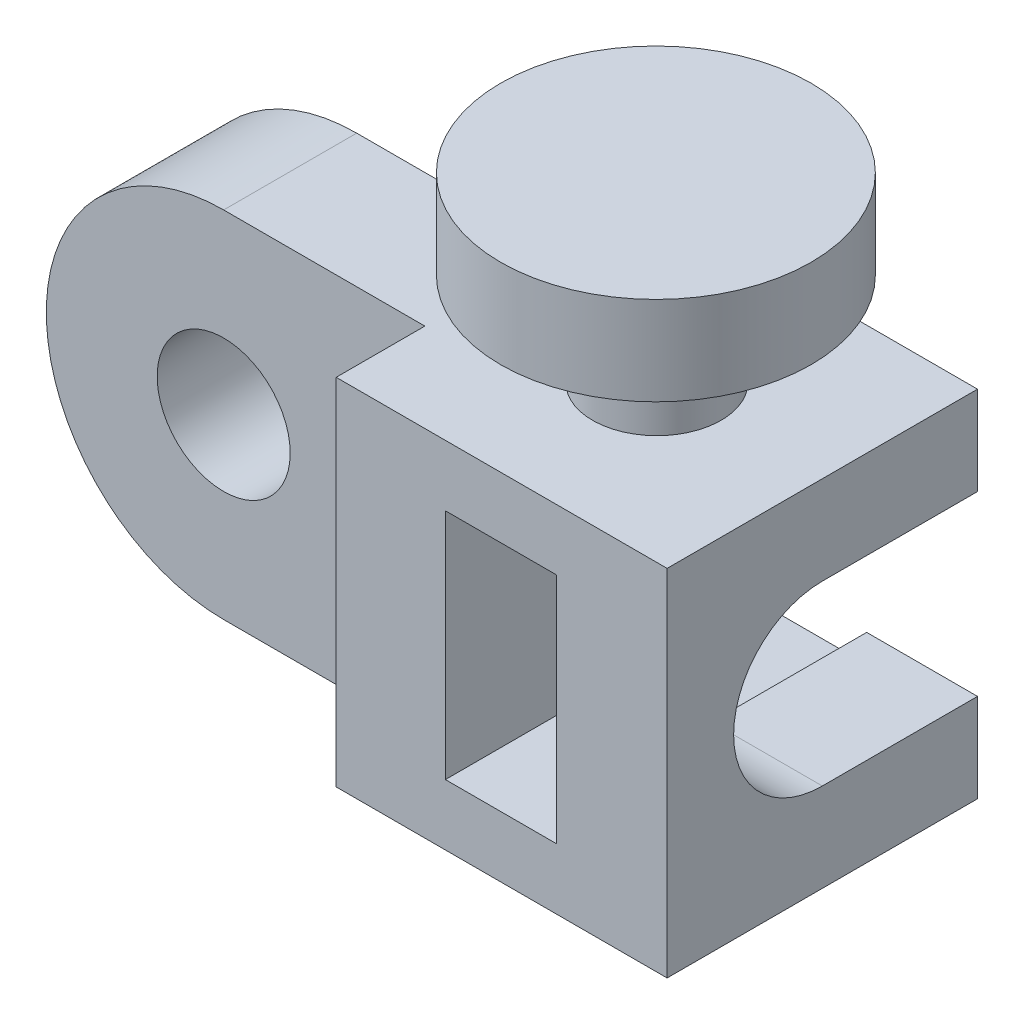
ISO-10303-21;
HEADER;
FILE_DESCRIPTION(('STEP AP214'),'2;1');
FILE_NAME('part.step','',(''),(''),'','','');
FILE_SCHEMA(('AUTOMOTIVE_DESIGN { 1 0 10303 214 1 1 1 1 }'));
ENDSEC;
DATA;
#1=APPLICATION_CONTEXT('core data for automotive mechanical design processes');
#2=APPLICATION_PROTOCOL_DEFINITION('international standard','automotive_design',2000,#1);
#3=PRODUCT_CONTEXT('',#1,'mechanical');
#4=PRODUCT('Part','Part','',(#3));
#5=PRODUCT_RELATED_PRODUCT_CATEGORY('part','',(#4));
#6=PRODUCT_DEFINITION_FORMATION('','',#4);
#7=PRODUCT_DEFINITION_CONTEXT('part definition',#1,'design');
#8=PRODUCT_DEFINITION('design','',#6,#7);
#9=PRODUCT_DEFINITION_SHAPE('','',#8);
#10=(LENGTH_UNIT() NAMED_UNIT(*) SI_UNIT(.MILLI.,.METRE.));
#11=(NAMED_UNIT(*) PLANE_ANGLE_UNIT() SI_UNIT($,.RADIAN.));
#12=(NAMED_UNIT(*) SI_UNIT($,.STERADIAN.) SOLID_ANGLE_UNIT());
#13=UNCERTAINTY_MEASURE_WITH_UNIT(LENGTH_MEASURE(1.E-05),#10,'distance_accuracy_value','');
#14=(GEOMETRIC_REPRESENTATION_CONTEXT(3) GLOBAL_UNCERTAINTY_ASSIGNED_CONTEXT((#13)) GLOBAL_UNIT_ASSIGNED_CONTEXT((#10,
#11,#12)) REPRESENTATION_CONTEXT('',''));
#15=CARTESIAN_POINT('',(0.,0.,0.));
#16=DIRECTION('',(0.,0.,1.));
#17=DIRECTION('',(1.,0.,0.));
#18=AXIS2_PLACEMENT_3D('',#15,#16,#17);
#19=CARTESIAN_POINT('',(0.,0.,-3.5));
#20=DIRECTION('',(0.,0.,1.));
#21=DIRECTION('',(1.,0.,0.));
#22=AXIS2_PLACEMENT_3D('',#19,#20,#21);
#23=PLANE('',#22);
#24=DIRECTION('',(0.,-1.,0.));
#25=VECTOR('',#24,1.);
#26=CARTESIAN_POINT('',(9.5,0.,-3.5));
#27=LINE('',#26,#25);
#28=CARTESIAN_POINT('',(9.5,-2.,-3.5));
#29=VERTEX_POINT('',#28);
#30=CARTESIAN_POINT('',(9.5,-2.625,-3.5));
#31=VERTEX_POINT('',#30);
#32=EDGE_CURVE('E252',#29,#31,#27,.T.);
#33=ORIENTED_EDGE('',*,*,#32,.F.);
#34=DIRECTION('',(-1.,0.,0.));
#35=VECTOR('',#34,1.);
#36=CARTESIAN_POINT('',(14.5,-2.,-3.5));
#37=LINE('',#36,#35);
#38=CARTESIAN_POINT('',(12.,-2.,-3.5));
#39=VERTEX_POINT('',#38);
#40=EDGE_CURVE('E154',#39,#29,#37,.T.);
#41=ORIENTED_EDGE('',*,*,#40,.F.);
#42=DIRECTION('',(0.,1.,0.));
#43=VECTOR('',#42,1.);
#44=CARTESIAN_POINT('',(12.,-4.,-3.5));
#45=LINE('',#44,#43);
#46=CARTESIAN_POINT('',(12.,-4.,-3.5));
#47=VERTEX_POINT('',#46);
#48=EDGE_CURVE('E238',#47,#39,#45,.T.);
#49=ORIENTED_EDGE('',*,*,#48,.F.);
#50=DIRECTION('',(1.,0.,0.));
#51=VECTOR('',#50,1.);
#52=CARTESIAN_POINT('',(12.,-4.,-3.5));
#53=LINE('',#52,#51);
#54=CARTESIAN_POINT('',(4.53690947743723,-4.,-3.5));
#55=VERTEX_POINT('',#54);
#56=EDGE_CURVE('E228',#55,#47,#53,.T.);
#57=ORIENTED_EDGE('',*,*,#56,.F.);
#58=DIRECTION('',(0.,-1.,0.));
#59=VECTOR('',#58,1.);
#60=CARTESIAN_POINT('',(4.53690947743723,-4.,-3.5));
#61=LINE('',#60,#59);
#62=CARTESIAN_POINT('',(4.53690947743723,4.,-3.5));
#63=VERTEX_POINT('',#62);
#64=EDGE_CURVE('E232',#63,#55,#61,.T.);
#65=ORIENTED_EDGE('',*,*,#64,.F.);
#66=DIRECTION('',(-1.,0.,0.));
#67=VECTOR('',#66,1.);
#68=CARTESIAN_POINT('',(12.,4.,-3.5));
#69=LINE('',#68,#67);
#70=CARTESIAN_POINT('',(12.,4.,-3.5));
#71=VERTEX_POINT('',#70);
#72=EDGE_CURVE('E235',#71,#63,#69,.T.);
#73=ORIENTED_EDGE('',*,*,#72,.F.);
#74=CARTESIAN_POINT('',(12.,2.,-3.5));
#75=VERTEX_POINT('',#74);
#76=EDGE_CURVE('E241',#75,#71,#45,.T.);
#77=ORIENTED_EDGE('',*,*,#76,.F.);
#78=DIRECTION('',(1.,0.,0.));
#79=VECTOR('',#78,1.);
#80=CARTESIAN_POINT('',(14.5,2.,-3.5));
#81=LINE('',#80,#79);
#82=CARTESIAN_POINT('',(9.5,2.,-3.5));
#83=VERTEX_POINT('',#82);
#84=EDGE_CURVE('E270',#83,#75,#81,.T.);
#85=ORIENTED_EDGE('',*,*,#84,.F.);
#86=CARTESIAN_POINT('',(9.5,2.625,-3.5));
#87=VERTEX_POINT('',#86);
#88=EDGE_CURVE('E163',#87,#83,#27,.T.);
#89=ORIENTED_EDGE('',*,*,#88,.F.);
#90=DIRECTION('',(1.,0.,0.));
#91=VECTOR('',#90,1.);
#92=CARTESIAN_POINT('',(0.,2.625,-3.5));
#93=LINE('',#92,#91);
#94=CARTESIAN_POINT('',(7.,2.625,-3.5));
#95=VERTEX_POINT('',#94);
#96=EDGE_CURVE('E253',#95,#87,#93,.T.);
#97=ORIENTED_EDGE('',*,*,#96,.F.);
#98=DIRECTION('',(0.,1.,0.));
#99=VECTOR('',#98,1.);
#100=CARTESIAN_POINT('',(7.,0.,-3.5));
#101=LINE('',#100,#99);
#102=CARTESIAN_POINT('',(7.,-2.625,-3.5));
#103=VERTEX_POINT('',#102);
#104=EDGE_CURVE('E255',#103,#95,#101,.T.);
#105=ORIENTED_EDGE('',*,*,#104,.F.);
#106=DIRECTION('',(-1.,0.,0.));
#107=VECTOR('',#106,1.);
#108=CARTESIAN_POINT('',(0.,-2.625,-3.5));
#109=LINE('',#108,#107);
#110=EDGE_CURVE('E257',#31,#103,#109,.T.);
#111=ORIENTED_EDGE('',*,*,#110,.F.);
#112=EDGE_LOOP('',(#33,#41,#49,#57,#65,#73,#77,#85,#89,#97,#105,#111));
#113=FACE_BOUND('',#112,.T.);
#114=ADVANCED_FACE('F36',(#113),#23,.F.);
#115=CARTESIAN_POINT('',(0.,0.,3.5));
#116=DIRECTION('',(0.,0.,1.));
#117=DIRECTION('',(1.,0.,0.));
#118=AXIS2_PLACEMENT_3D('',#115,#116,#117);
#119=PLANE('',#118);
#120=DIRECTION('',(0.,1.,0.));
#121=VECTOR('',#120,1.);
#122=CARTESIAN_POINT('',(12.,-4.,3.5));
#123=LINE('',#122,#121);
#124=CARTESIAN_POINT('',(12.,-4.,3.5));
#125=VERTEX_POINT('',#124);
#126=CARTESIAN_POINT('',(12.,4.,3.5));
#127=VERTEX_POINT('',#126);
#128=EDGE_CURVE('E231',#125,#127,#123,.T.);
#129=ORIENTED_EDGE('',*,*,#128,.T.);
#130=DIRECTION('',(-1.,0.,0.));
#131=VECTOR('',#130,1.);
#132=CARTESIAN_POINT('',(12.,4.,3.5));
#133=LINE('',#132,#131);
#134=CARTESIAN_POINT('',(4.53690947743723,4.,3.5));
#135=VERTEX_POINT('',#134);
#136=EDGE_CURVE('E247',#127,#135,#133,.T.);
#137=ORIENTED_EDGE('',*,*,#136,.T.);
#138=DIRECTION('',(0.,-1.,0.));
#139=VECTOR('',#138,1.);
#140=CARTESIAN_POINT('',(4.53690947743723,-4.,3.5));
#141=LINE('',#140,#139);
#142=CARTESIAN_POINT('',(4.53690947743723,-4.,3.5));
#143=VERTEX_POINT('',#142);
#144=EDGE_CURVE('E245',#135,#143,#141,.T.);
#145=ORIENTED_EDGE('',*,*,#144,.T.);
#146=DIRECTION('',(1.,0.,0.));
#147=VECTOR('',#146,1.);
#148=CARTESIAN_POINT('',(12.,-4.,3.5));
#149=LINE('',#148,#147);
#150=EDGE_CURVE('E242',#143,#125,#149,.T.);
#151=ORIENTED_EDGE('',*,*,#150,.T.);
#152=EDGE_LOOP('',(#129,#137,#145,#151));
#153=FACE_BOUND('',#152,.T.);
#154=DIRECTION('',(1.,0.,0.));
#155=VECTOR('',#154,1.);
#156=CARTESIAN_POINT('',(0.,2.625,3.5));
#157=LINE('',#156,#155);
#158=CARTESIAN_POINT('',(7.,2.625,3.5));
#159=VERTEX_POINT('',#158);
#160=CARTESIAN_POINT('',(9.5,2.625,3.5));
#161=VERTEX_POINT('',#160);
#162=EDGE_CURVE('E176',#159,#161,#157,.T.);
#163=ORIENTED_EDGE('',*,*,#162,.T.);
#164=DIRECTION('',(0.,-1.,0.));
#165=VECTOR('',#164,1.);
#166=CARTESIAN_POINT('',(9.5,0.,3.5));
#167=LINE('',#166,#165);
#168=CARTESIAN_POINT('',(9.5,-2.625,3.5));
#169=VERTEX_POINT('',#168);
#170=EDGE_CURVE('E44',#161,#169,#167,.T.);
#171=ORIENTED_EDGE('',*,*,#170,.T.);
#172=DIRECTION('',(-1.,0.,0.));
#173=VECTOR('',#172,1.);
#174=CARTESIAN_POINT('',(0.,-2.625,3.5));
#175=LINE('',#174,#173);
#176=CARTESIAN_POINT('',(7.,-2.625,3.5));
#177=VERTEX_POINT('',#176);
#178=EDGE_CURVE('E182',#169,#177,#175,.T.);
#179=ORIENTED_EDGE('',*,*,#178,.T.);
#180=DIRECTION('',(0.,1.,0.));
#181=VECTOR('',#180,1.);
#182=CARTESIAN_POINT('',(7.,0.,3.5));
#183=LINE('',#182,#181);
#184=EDGE_CURVE('E179',#177,#159,#183,.T.);
#185=ORIENTED_EDGE('',*,*,#184,.T.);
#186=EDGE_LOOP('',(#163,#171,#179,#185));
#187=FACE_BOUND('',#186,.T.);
#188=ADVANCED_FACE('F303',(#153,#187),#119,.T.);
#189=CARTESIAN_POINT('',(0.,0.,1.5));
#190=DIRECTION('',(0.,0.,1.));
#191=DIRECTION('',(1.,0.,0.));
#192=AXIS2_PLACEMENT_3D('',#189,#190,#191);
#193=PLANE('',#192);
#194=CARTESIAN_POINT('',(0.,0.,1.5));
#195=DIRECTION('',(0.,0.,1.));
#196=DIRECTION('',(1.,0.,0.));
#197=AXIS2_PLACEMENT_3D('',#194,#195,#196);
#198=CIRCLE('',#197,1.5);
#199=CARTESIAN_POINT('',(1.5,0.,1.5));
#200=VERTEX_POINT('',#199);
#201=EDGE_CURVE('E197',#200,#200,#198,.T.);
#202=ORIENTED_EDGE('',*,*,#201,.F.);
#203=EDGE_LOOP('',(#202));
#204=FACE_BOUND('',#203,.T.);
#205=DIRECTION('',(1.,0.,0.));
#206=VECTOR('',#205,1.);
#207=CARTESIAN_POINT('',(0.,-4.,1.5));
#208=LINE('',#207,#206);
#209=CARTESIAN_POINT('',(0.,-4.,1.5));
#210=VERTEX_POINT('',#209);
#211=CARTESIAN_POINT('',(4.53690947743723,-4.,1.5));
#212=VERTEX_POINT('',#211);
#213=EDGE_CURVE('E213',#210,#212,#208,.T.);
#214=ORIENTED_EDGE('',*,*,#213,.T.);
#215=DIRECTION('',(0.,1.,0.));
#216=VECTOR('',#215,1.);
#217=CARTESIAN_POINT('',(4.53690947743723,0.,1.5));
#218=LINE('',#217,#216);
#219=CARTESIAN_POINT('',(4.53690947743723,4.,1.5));
#220=VERTEX_POINT('',#219);
#221=EDGE_CURVE('E210',#212,#220,#218,.T.);
#222=ORIENTED_EDGE('',*,*,#221,.T.);
#223=DIRECTION('',(1.,0.,0.));
#224=VECTOR('',#223,1.);
#225=CARTESIAN_POINT('',(0.,4.,1.5));
#226=LINE('',#225,#224);
#227=CARTESIAN_POINT('',(0.,4.,1.5));
#228=VERTEX_POINT('',#227);
#229=EDGE_CURVE('E201',#228,#220,#226,.T.);
#230=ORIENTED_EDGE('',*,*,#229,.F.);
#231=CARTESIAN_POINT('',(0.,0.,1.5));
#232=DIRECTION('',(0.,0.,1.));
#233=DIRECTION('',(1.,0.,0.));
#234=AXIS2_PLACEMENT_3D('',#231,#232,#233);
#235=CIRCLE('',#234,4.);
#236=EDGE_CURVE('E215',#228,#210,#235,.T.);
#237=ORIENTED_EDGE('',*,*,#236,.T.);
#238=EDGE_LOOP('',(#214,#222,#230,#237));
#239=FACE_BOUND('',#238,.T.);
#240=ADVANCED_FACE('F309',(#204,#239),#193,.T.);
#241=CARTESIAN_POINT('',(0.,0.,-1.5));
#242=DIRECTION('',(0.,0.,1.));
#243=DIRECTION('',(1.,0.,0.));
#244=AXIS2_PLACEMENT_3D('',#241,#242,#243);
#245=PLANE('',#244);
#246=CARTESIAN_POINT('',(0.,0.,-1.5));
#247=DIRECTION('',(0.,0.,1.));
#248=DIRECTION('',(1.,0.,0.));
#249=AXIS2_PLACEMENT_3D('',#246,#247,#248);
#250=CIRCLE('',#249,1.5);
#251=CARTESIAN_POINT('',(1.5,0.,-1.5));
#252=VERTEX_POINT('',#251);
#253=EDGE_CURVE('E198',#252,#252,#250,.T.);
#254=ORIENTED_EDGE('',*,*,#253,.T.);
#255=EDGE_LOOP('',(#254));
#256=FACE_BOUND('',#255,.T.);
#257=DIRECTION('',(0.,1.,0.));
#258=VECTOR('',#257,1.);
#259=CARTESIAN_POINT('',(4.53690947743723,0.,-1.5));
#260=LINE('',#259,#258);
#261=CARTESIAN_POINT('',(4.53690947743723,-4.,-1.5));
#262=VERTEX_POINT('',#261);
#263=CARTESIAN_POINT('',(4.53690947743723,4.,-1.5));
#264=VERTEX_POINT('',#263);
#265=EDGE_CURVE('E185',#262,#264,#260,.T.);
#266=ORIENTED_EDGE('',*,*,#265,.F.);
#267=DIRECTION('',(1.,0.,0.));
#268=VECTOR('',#267,1.);
#269=CARTESIAN_POINT('',(0.,-4.,-1.5));
#270=LINE('',#269,#268);
#271=CARTESIAN_POINT('',(0.,-4.,-1.5));
#272=VERTEX_POINT('',#271);
#273=EDGE_CURVE('E202',#272,#262,#270,.T.);
#274=ORIENTED_EDGE('',*,*,#273,.F.);
#275=CARTESIAN_POINT('',(0.,0.,-1.5));
#276=DIRECTION('',(0.,0.,1.));
#277=DIRECTION('',(1.,0.,0.));
#278=AXIS2_PLACEMENT_3D('',#275,#276,#277);
#279=CIRCLE('',#278,4.);
#280=CARTESIAN_POINT('',(0.,4.,-1.5));
#281=VERTEX_POINT('',#280);
#282=EDGE_CURVE('E205',#281,#272,#279,.T.);
#283=ORIENTED_EDGE('',*,*,#282,.F.);
#284=DIRECTION('',(1.,0.,0.));
#285=VECTOR('',#284,1.);
#286=CARTESIAN_POINT('',(0.,4.,-1.5));
#287=LINE('',#286,#285);
#288=EDGE_CURVE('E207',#281,#264,#287,.T.);
#289=ORIENTED_EDGE('',*,*,#288,.T.);
#290=EDGE_LOOP('',(#266,#274,#283,#289));
#291=FACE_BOUND('',#290,.T.);
#292=ADVANCED_FACE('F322',(#256,#291),#245,.F.);
#293=CARTESIAN_POINT('',(0.,4.,1.5));
#294=DIRECTION('',(0.,1.,0.));
#295=DIRECTION('',(-1.,0.,0.));
#296=AXIS2_PLACEMENT_3D('',#293,#294,#295);
#297=PLANE('',#296);
#298=CARTESIAN_POINT('',(8.26845473871862,4.,0.));
#299=DIRECTION('',(0.,1.,0.));
#300=DIRECTION('',(-1.,0.,0.));
#301=AXIS2_PLACEMENT_3D('',#298,#299,#300);
#302=CIRCLE('',#301,1.45);
#303=CARTESIAN_POINT('',(6.81845473871862,4.,0.));
#304=VERTEX_POINT('',#303);
#305=EDGE_CURVE('E273',#304,#304,#302,.T.);
#306=ORIENTED_EDGE('',*,*,#305,.F.);
#307=EDGE_LOOP('',(#306));
#308=FACE_BOUND('',#307,.T.);
#309=DIRECTION('',(0.,0.,-1.));
#310=VECTOR('',#309,1.);
#311=CARTESIAN_POINT('',(4.53690947743723,4.,3.5));
#312=LINE('',#311,#310);
#313=EDGE_CURVE('E223',#264,#63,#312,.T.);
#314=ORIENTED_EDGE('',*,*,#313,.F.);
#315=ORIENTED_EDGE('',*,*,#288,.F.);
#316=DIRECTION('',(0.,0.,-1.));
#317=VECTOR('',#316,1.);
#318=CARTESIAN_POINT('',(0.,4.,1.5));
#319=LINE('',#318,#317);
#320=EDGE_CURVE('E187',#228,#281,#319,.T.);
#321=ORIENTED_EDGE('',*,*,#320,.F.);
#322=ORIENTED_EDGE('',*,*,#229,.T.);
#323=EDGE_CURVE('E220',#135,#220,#312,.T.);
#324=ORIENTED_EDGE('',*,*,#323,.F.);
#325=ORIENTED_EDGE('',*,*,#136,.F.);
#326=DIRECTION('',(0.,0.,-1.));
#327=VECTOR('',#326,1.);
#328=CARTESIAN_POINT('',(12.,4.,1.5));
#329=LINE('',#328,#327);
#330=EDGE_CURVE('E194',#127,#71,#329,.T.);
#331=ORIENTED_EDGE('',*,*,#330,.T.);
#332=ORIENTED_EDGE('',*,*,#72,.T.);
#333=EDGE_LOOP('',(#314,#315,#321,#322,#324,#325,#331,#332));
#334=FACE_BOUND('',#333,.T.);
#335=ADVANCED_FACE('F38',(#308,#334),#297,.T.);
#336=CARTESIAN_POINT('',(0.,0.,1.5));
#337=DIRECTION('',(0.,0.,-1.));
#338=DIRECTION('',(-1.,0.,0.));
#339=AXIS2_PLACEMENT_3D('',#336,#337,#338);
#340=CYLINDRICAL_SURFACE('',#339,4.);
#341=ORIENTED_EDGE('',*,*,#282,.T.);
#342=DIRECTION('',(0.,0.,-1.));
#343=VECTOR('',#342,1.);
#344=CARTESIAN_POINT('',(0.,-4.,1.5));
#345=LINE('',#344,#343);
#346=EDGE_CURVE('E189',#210,#272,#345,.T.);
#347=ORIENTED_EDGE('',*,*,#346,.F.);
#348=ORIENTED_EDGE('',*,*,#236,.F.);
#349=ORIENTED_EDGE('',*,*,#320,.T.);
#350=EDGE_LOOP('',(#341,#347,#348,#349));
#351=FACE_BOUND('',#350,.T.);
#352=ADVANCED_FACE('F337',(#351),#340,.T.);
#353=CARTESIAN_POINT('',(0.,-4.,1.5));
#354=DIRECTION('',(0.,1.,0.));
#355=DIRECTION('',(0.,0.,1.));
#356=AXIS2_PLACEMENT_3D('',#353,#354,#355);
#357=PLANE('',#356);
#358=DIRECTION('',(0.,0.,-1.));
#359=VECTOR('',#358,1.);
#360=CARTESIAN_POINT('',(12.,-4.,1.5));
#361=LINE('',#360,#359);
#362=EDGE_CURVE('E192',#125,#47,#361,.T.);
#363=ORIENTED_EDGE('',*,*,#362,.F.);
#364=ORIENTED_EDGE('',*,*,#150,.F.);
#365=DIRECTION('',(0.,0.,-1.));
#366=VECTOR('',#365,1.);
#367=CARTESIAN_POINT('',(4.53690947743723,-4.,3.5));
#368=LINE('',#367,#366);
#369=EDGE_CURVE('E224',#143,#212,#368,.T.);
#370=ORIENTED_EDGE('',*,*,#369,.T.);
#371=ORIENTED_EDGE('',*,*,#213,.F.);
#372=ORIENTED_EDGE('',*,*,#346,.T.);
#373=ORIENTED_EDGE('',*,*,#273,.T.);
#374=EDGE_CURVE('E227',#262,#55,#368,.T.);
#375=ORIENTED_EDGE('',*,*,#374,.T.);
#376=ORIENTED_EDGE('',*,*,#56,.T.);
#377=EDGE_LOOP('',(#363,#364,#370,#371,#372,#373,#375,#376));
#378=FACE_BOUND('',#377,.T.);
#379=ADVANCED_FACE('F334',(#378),#357,.F.);
#380=CARTESIAN_POINT('',(12.,0.,1.5));
#381=DIRECTION('',(1.,0.,0.));
#382=DIRECTION('',(0.,1.,0.));
#383=AXIS2_PLACEMENT_3D('',#380,#381,#382);
#384=PLANE('',#383);
#385=DIRECTION('',(0.,0.,-1.));
#386=VECTOR('',#385,1.);
#387=CARTESIAN_POINT('',(12.,-2.,1.5));
#388=LINE('',#387,#386);
#389=CARTESIAN_POINT('',(12.,-2.,0.));
#390=VERTEX_POINT('',#389);
#391=EDGE_CURVE('E171',#390,#39,#388,.T.);
#392=ORIENTED_EDGE('',*,*,#391,.F.);
#393=CARTESIAN_POINT('',(12.,0.,0.));
#394=DIRECTION('',(1.,0.,0.));
#395=DIRECTION('',(0.,1.,0.));
#396=AXIS2_PLACEMENT_3D('',#393,#394,#395);
#397=CIRCLE('',#396,2.);
#398=CARTESIAN_POINT('',(12.,2.,0.));
#399=VERTEX_POINT('',#398);
#400=EDGE_CURVE('E167',#399,#390,#397,.T.);
#401=ORIENTED_EDGE('',*,*,#400,.F.);
#402=DIRECTION('',(0.,0.,1.));
#403=VECTOR('',#402,1.);
#404=CARTESIAN_POINT('',(12.,2.,1.5));
#405=LINE('',#404,#403);
#406=EDGE_CURVE('E51',#75,#399,#405,.T.);
#407=ORIENTED_EDGE('',*,*,#406,.F.);
#408=ORIENTED_EDGE('',*,*,#76,.T.);
#409=ORIENTED_EDGE('',*,*,#330,.F.);
#410=ORIENTED_EDGE('',*,*,#128,.F.);
#411=ORIENTED_EDGE('',*,*,#362,.T.);
#412=ORIENTED_EDGE('',*,*,#48,.T.);
#413=EDGE_LOOP('',(#392,#401,#407,#408,#409,#410,#411,#412));
#414=FACE_BOUND('',#413,.T.);
#415=ADVANCED_FACE('F330',(#414),#384,.T.);
#416=CARTESIAN_POINT('',(0.,0.,1.5));
#417=DIRECTION('',(0.,0.,-1.));
#418=DIRECTION('',(-1.,0.,0.));
#419=AXIS2_PLACEMENT_3D('',#416,#417,#418);
#420=CYLINDRICAL_SURFACE('',#419,1.5);
#421=ORIENTED_EDGE('',*,*,#201,.T.);
#422=EDGE_LOOP('',(#421));
#423=FACE_BOUND('',#422,.T.);
#424=ORIENTED_EDGE('',*,*,#253,.F.);
#425=EDGE_LOOP('',(#424));
#426=FACE_BOUND('',#425,.T.);
#427=ADVANCED_FACE('F327',(#423,#426),#420,.F.);
#428=CARTESIAN_POINT('',(4.53690947743723,-4.,3.5));
#429=DIRECTION('',(1.,0.,0.));
#430=DIRECTION('',(0.,0.,-1.));
#431=AXIS2_PLACEMENT_3D('',#428,#429,#430);
#432=PLANE('',#431);
#433=ORIENTED_EDGE('',*,*,#374,.F.);
#434=ORIENTED_EDGE('',*,*,#265,.T.);
#435=ORIENTED_EDGE('',*,*,#313,.T.);
#436=ORIENTED_EDGE('',*,*,#64,.T.);
#437=EDGE_LOOP('',(#433,#434,#435,#436));
#438=FACE_BOUND('',#437,.T.);
#439=ADVANCED_FACE('F318',(#438),#432,.F.);
#440=ORIENTED_EDGE('',*,*,#221,.F.);
#441=ORIENTED_EDGE('',*,*,#369,.F.);
#442=ORIENTED_EDGE('',*,*,#144,.F.);
#443=ORIENTED_EDGE('',*,*,#323,.T.);
#444=EDGE_LOOP('',(#440,#441,#442,#443));
#445=FACE_BOUND('',#444,.T.);
#446=ADVANCED_FACE('F315',(#445),#432,.F.);
#447=CARTESIAN_POINT('',(9.5,2.625,8.5));
#448=DIRECTION('',(-1.,0.,0.));
#449=DIRECTION('',(0.,0.,1.));
#450=AXIS2_PLACEMENT_3D('',#447,#448,#449);
#451=PLANE('',#450);
#452=DIRECTION('',(0.,0.,-1.));
#453=VECTOR('',#452,1.);
#454=CARTESIAN_POINT('',(9.5,-2.,0.));
#455=LINE('',#454,#453);
#456=CARTESIAN_POINT('',(9.5,-2.,0.));
#457=VERTEX_POINT('',#456);
#458=EDGE_CURVE('E59',#457,#29,#455,.T.);
#459=ORIENTED_EDGE('',*,*,#458,.T.);
#460=ORIENTED_EDGE('',*,*,#32,.T.);
#461=DIRECTION('',(0.,0.,-1.));
#462=VECTOR('',#461,1.);
#463=CARTESIAN_POINT('',(9.5,-2.625,8.5));
#464=LINE('',#463,#462);
#465=EDGE_CURVE('E166',#169,#31,#464,.T.);
#466=ORIENTED_EDGE('',*,*,#465,.F.);
#467=ORIENTED_EDGE('',*,*,#170,.F.);
#468=DIRECTION('',(0.,0.,-1.));
#469=VECTOR('',#468,1.);
#470=CARTESIAN_POINT('',(9.5,2.625,8.5));
#471=LINE('',#470,#469);
#472=EDGE_CURVE('E259',#161,#87,#471,.T.);
#473=ORIENTED_EDGE('',*,*,#472,.T.);
#474=ORIENTED_EDGE('',*,*,#88,.T.);
#475=DIRECTION('',(0.,0.,-1.));
#476=VECTOR('',#475,1.);
#477=CARTESIAN_POINT('',(9.5,2.,0.));
#478=LINE('',#477,#476);
#479=CARTESIAN_POINT('',(9.5,2.,0.));
#480=VERTEX_POINT('',#479);
#481=EDGE_CURVE('E148',#480,#83,#478,.T.);
#482=ORIENTED_EDGE('',*,*,#481,.F.);
#483=CARTESIAN_POINT('',(9.5,0.,0.));
#484=DIRECTION('',(-1.,0.,0.));
#485=DIRECTION('',(0.,0.,1.));
#486=AXIS2_PLACEMENT_3D('',#483,#484,#485);
#487=CIRCLE('',#486,2.);
#488=EDGE_CURVE('E160',#457,#480,#487,.T.);
#489=ORIENTED_EDGE('',*,*,#488,.F.);
#490=EDGE_LOOP('',(#459,#460,#466,#467,#473,#474,#482,#489));
#491=FACE_BOUND('',#490,.T.);
#492=ADVANCED_FACE('F159',(#491),#451,.T.);
#493=CARTESIAN_POINT('',(7.,2.625,8.5));
#494=DIRECTION('',(0.,-1.,0.));
#495=DIRECTION('',(0.,0.,-1.));
#496=AXIS2_PLACEMENT_3D('',#493,#494,#495);
#497=PLANE('',#496);
#498=ORIENTED_EDGE('',*,*,#96,.T.);
#499=ORIENTED_EDGE('',*,*,#472,.F.);
#500=ORIENTED_EDGE('',*,*,#162,.F.);
#501=DIRECTION('',(0.,0.,-1.));
#502=VECTOR('',#501,1.);
#503=CARTESIAN_POINT('',(7.,2.625,8.5));
#504=LINE('',#503,#502);
#505=EDGE_CURVE('E261',#159,#95,#504,.T.);
#506=ORIENTED_EDGE('',*,*,#505,.T.);
#507=EDGE_LOOP('',(#498,#499,#500,#506));
#508=FACE_BOUND('',#507,.T.);
#509=ADVANCED_FACE('F378',(#508),#497,.T.);
#510=CARTESIAN_POINT('',(7.,2.625,8.5));
#511=DIRECTION('',(1.,0.,0.));
#512=DIRECTION('',(0.,0.,-1.));
#513=AXIS2_PLACEMENT_3D('',#510,#511,#512);
#514=PLANE('',#513);
#515=ORIENTED_EDGE('',*,*,#104,.T.);
#516=ORIENTED_EDGE('',*,*,#505,.F.);
#517=ORIENTED_EDGE('',*,*,#184,.F.);
#518=DIRECTION('',(0.,0.,-1.));
#519=VECTOR('',#518,1.);
#520=CARTESIAN_POINT('',(7.,-2.625,8.5));
#521=LINE('',#520,#519);
#522=EDGE_CURVE('E169',#177,#103,#521,.T.);
#523=ORIENTED_EDGE('',*,*,#522,.T.);
#524=EDGE_LOOP('',(#515,#516,#517,#523));
#525=FACE_BOUND('',#524,.T.);
#526=ADVANCED_FACE('F383',(#525),#514,.T.);
#527=CARTESIAN_POINT('',(7.,-2.625,8.5));
#528=DIRECTION('',(0.,1.,0.));
#529=DIRECTION('',(0.,0.,1.));
#530=AXIS2_PLACEMENT_3D('',#527,#528,#529);
#531=PLANE('',#530);
#532=ORIENTED_EDGE('',*,*,#110,.T.);
#533=ORIENTED_EDGE('',*,*,#522,.F.);
#534=ORIENTED_EDGE('',*,*,#178,.F.);
#535=ORIENTED_EDGE('',*,*,#465,.T.);
#536=EDGE_LOOP('',(#532,#533,#534,#535));
#537=FACE_BOUND('',#536,.T.);
#538=ADVANCED_FACE('F385',(#537),#531,.T.);
#539=CARTESIAN_POINT('',(9.,0.,0.));
#540=DIRECTION('',(1.,0.,0.));
#541=DIRECTION('',(0.,1.,0.));
#542=AXIS2_PLACEMENT_3D('',#539,#540,#541);
#543=CYLINDRICAL_SURFACE('',#542,2.);
#544=ORIENTED_EDGE('',*,*,#400,.T.);
#545=DIRECTION('',(1.,0.,0.));
#546=VECTOR('',#545,1.);
#547=CARTESIAN_POINT('',(9.,-2.,0.));
#548=LINE('',#547,#546);
#549=EDGE_CURVE('E11',#390,#457,#548,.F.);
#550=ORIENTED_EDGE('',*,*,#549,.T.);
#551=ORIENTED_EDGE('',*,*,#488,.T.);
#552=DIRECTION('',(1.,0.,0.));
#553=VECTOR('',#552,1.);
#554=CARTESIAN_POINT('',(14.5,2.,0.));
#555=LINE('',#554,#553);
#556=EDGE_CURVE('E145',#480,#399,#555,.T.);
#557=ORIENTED_EDGE('',*,*,#556,.T.);
#558=EDGE_LOOP('',(#544,#550,#551,#557));
#559=FACE_BOUND('',#558,.T.);
#560=ADVANCED_FACE('F165',(#559),#543,.F.);
#561=CARTESIAN_POINT('',(14.5,2.,0.));
#562=DIRECTION('',(0.,1.,0.));
#563=DIRECTION('',(0.,0.,1.));
#564=AXIS2_PLACEMENT_3D('',#561,#562,#563);
#565=PLANE('',#564);
#566=ORIENTED_EDGE('',*,*,#406,.T.);
#567=ORIENTED_EDGE('',*,*,#556,.F.);
#568=ORIENTED_EDGE('',*,*,#481,.T.);
#569=ORIENTED_EDGE('',*,*,#84,.T.);
#570=EDGE_LOOP('',(#566,#567,#568,#569));
#571=FACE_BOUND('',#570,.T.);
#572=ADVANCED_FACE('F147',(#571),#565,.F.);
#573=CARTESIAN_POINT('',(14.5,-2.,0.));
#574=DIRECTION('',(0.,-1.,0.));
#575=DIRECTION('',(1.,0.,0.));
#576=AXIS2_PLACEMENT_3D('',#573,#574,#575);
#577=PLANE('',#576);
#578=ORIENTED_EDGE('',*,*,#391,.T.);
#579=ORIENTED_EDGE('',*,*,#40,.T.);
#580=ORIENTED_EDGE('',*,*,#458,.F.);
#581=ORIENTED_EDGE('',*,*,#549,.F.);
#582=EDGE_LOOP('',(#578,#579,#580,#581));
#583=FACE_BOUND('',#582,.T.);
#584=ADVANCED_FACE('F386',(#583),#577,.F.);
#585=CARTESIAN_POINT('',(8.26845473871862,6.1,0.));
#586=DIRECTION('',(0.,-1.,0.));
#587=DIRECTION('',(1.,0.,0.));
#588=AXIS2_PLACEMENT_3D('',#585,#586,#587);
#589=CYLINDRICAL_SURFACE('',#588,1.45);
#590=CARTESIAN_POINT('',(8.26845473871862,6.1,0.));
#591=DIRECTION('',(0.,1.,0.));
#592=DIRECTION('',(-1.,0.,0.));
#593=AXIS2_PLACEMENT_3D('',#590,#591,#592);
#594=CIRCLE('',#593,1.45);
#595=CARTESIAN_POINT('',(6.81845473871862,6.1,0.));
#596=VERTEX_POINT('',#595);
#597=EDGE_CURVE('E271',#596,#596,#594,.T.);
#598=ORIENTED_EDGE('',*,*,#597,.F.);
#599=EDGE_LOOP('',(#598));
#600=FACE_BOUND('',#599,.T.);
#601=ORIENTED_EDGE('',*,*,#305,.T.);
#602=EDGE_LOOP('',(#601));
#603=FACE_BOUND('',#602,.T.);
#604=ADVANCED_FACE('F290',(#600,#603),#589,.T.);
#605=CARTESIAN_POINT('',(8.24636418720885,8.1,0.));
#606=DIRECTION('',(0.,-1.,0.));
#607=DIRECTION('',(1.,0.,0.));
#608=AXIS2_PLACEMENT_3D('',#605,#606,#607);
#609=CYLINDRICAL_SURFACE('',#608,3.5);
#610=CARTESIAN_POINT('',(8.24636418720885,8.1,0.));
#611=DIRECTION('',(0.,1.,0.));
#612=DIRECTION('',(-1.,0.,0.));
#613=AXIS2_PLACEMENT_3D('',#610,#611,#612);
#614=CIRCLE('',#613,3.5);
#615=CARTESIAN_POINT('',(4.74636418720884,8.1,0.));
#616=VERTEX_POINT('',#615);
#617=EDGE_CURVE('E276',#616,#616,#614,.T.);
#618=ORIENTED_EDGE('',*,*,#617,.F.);
#619=EDGE_LOOP('',(#618));
#620=FACE_BOUND('',#619,.T.);
#621=CARTESIAN_POINT('',(8.24636418720885,6.1,0.));
#622=DIRECTION('',(0.,1.,0.));
#623=DIRECTION('',(-1.,0.,0.));
#624=AXIS2_PLACEMENT_3D('',#621,#622,#623);
#625=CIRCLE('',#624,3.5);
#626=CARTESIAN_POINT('',(4.74636418720884,6.1,0.));
#627=VERTEX_POINT('',#626);
#628=EDGE_CURVE('E279',#627,#627,#625,.T.);
#629=ORIENTED_EDGE('',*,*,#628,.T.);
#630=EDGE_LOOP('',(#629));
#631=FACE_BOUND('',#630,.T.);
#632=ADVANCED_FACE('F287',(#620,#631),#609,.T.);
#633=CARTESIAN_POINT('',(8.24636418720885,8.1,0.));
#634=DIRECTION('',(0.,1.,0.));
#635=DIRECTION('',(-1.,0.,0.));
#636=AXIS2_PLACEMENT_3D('',#633,#634,#635);
#637=PLANE('',#636);
#638=ORIENTED_EDGE('',*,*,#617,.T.);
#639=EDGE_LOOP('',(#638));
#640=FACE_BOUND('',#639,.T.);
#641=ADVANCED_FACE('F285',(#640),#637,.T.);
#642=CARTESIAN_POINT('',(8.24636418720885,6.1,0.));
#643=DIRECTION('',(0.,1.,0.));
#644=DIRECTION('',(-1.,0.,0.));
#645=AXIS2_PLACEMENT_3D('',#642,#643,#644);
#646=PLANE('',#645);
#647=ORIENTED_EDGE('',*,*,#597,.T.);
#648=EDGE_LOOP('',(#647));
#649=FACE_BOUND('',#648,.T.);
#650=ORIENTED_EDGE('',*,*,#628,.F.);
#651=EDGE_LOOP('',(#650));
#652=FACE_BOUND('',#651,.T.);
#653=ADVANCED_FACE('F294',(#649,#652),#646,.F.);
#654=CLOSED_SHELL('',(#114,#188,#240,#292,#335,#352,#379,#415,#427,#439,#446,#492,#509,#526,
#538,#560,#572,#584,#604,#632,#641,#653));
#655=MANIFOLD_SOLID_BREP('B2',#654);
#656=ADVANCED_BREP_SHAPE_REPRESENTATION('',(#18,#655),#14);
#657=SHAPE_DEFINITION_REPRESENTATION(#9,#656);
ENDSEC;
END-ISO-10303-21;
